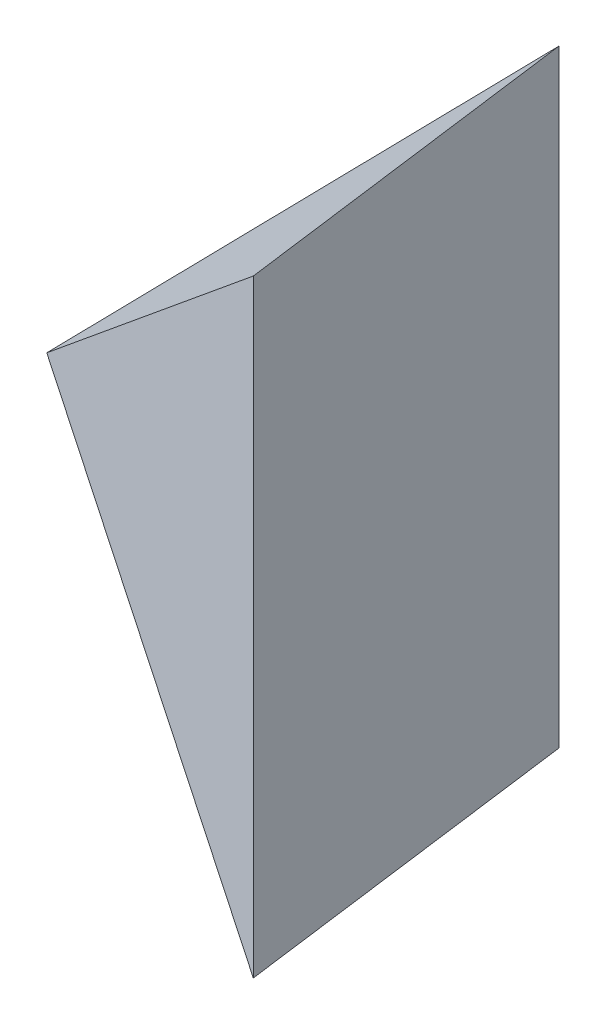
ISO-10303-21;
HEADER;
FILE_DESCRIPTION(('STEP AP214'),'2;1');
FILE_NAME('part.step','',(''),(''),'','','');
FILE_SCHEMA(('AUTOMOTIVE_DESIGN { 1 0 10303 214 1 1 1 1 }'));
ENDSEC;
DATA;
#1=APPLICATION_CONTEXT('core data for automotive mechanical design processes');
#2=APPLICATION_PROTOCOL_DEFINITION('international standard','automotive_design',2000,#1);
#3=PRODUCT_CONTEXT('',#1,'mechanical');
#4=PRODUCT('Part','Part','',(#3));
#5=PRODUCT_RELATED_PRODUCT_CATEGORY('part','',(#4));
#6=PRODUCT_DEFINITION_FORMATION('','',#4);
#7=PRODUCT_DEFINITION_CONTEXT('part definition',#1,'design');
#8=PRODUCT_DEFINITION('design','',#6,#7);
#9=PRODUCT_DEFINITION_SHAPE('','',#8);
#10=(LENGTH_UNIT() NAMED_UNIT(*) SI_UNIT(.MILLI.,.METRE.));
#11=(NAMED_UNIT(*) PLANE_ANGLE_UNIT() SI_UNIT($,.RADIAN.));
#12=(NAMED_UNIT(*) SI_UNIT($,.STERADIAN.) SOLID_ANGLE_UNIT());
#13=UNCERTAINTY_MEASURE_WITH_UNIT(LENGTH_MEASURE(1.E-05),#10,'distance_accuracy_value','');
#14=(GEOMETRIC_REPRESENTATION_CONTEXT(3) GLOBAL_UNCERTAINTY_ASSIGNED_CONTEXT((#13)) GLOBAL_UNIT_ASSIGNED_CONTEXT((#10,
#11,#12)) REPRESENTATION_CONTEXT('',''));
#15=CARTESIAN_POINT('',(0.,0.,0.));
#16=DIRECTION('',(0.,0.,1.));
#17=DIRECTION('',(1.,0.,0.));
#18=AXIS2_PLACEMENT_3D('',#15,#16,#17);
#19=CARTESIAN_POINT('',(730.12734793592,491.98228335744,319.93696683246));
#20=DIRECTION('',(-0.99144486137382,0.,0.130526192219976));
#21=DIRECTION('',(0.,1.,0.));
#22=AXIS2_PLACEMENT_3D('',#19,#20,#21);
#23=PLANE('',#22);
#24=DIRECTION('',(0.,-1.,0.));
#25=VECTOR('',#24,1.);
#26=CARTESIAN_POINT('',(730.12734793592,491.98228335744,319.93696683246));
#27=LINE('',#26,#25);
#28=CARTESIAN_POINT('',(730.12734793592,491.98228335744,319.93696683246));
#29=VERTEX_POINT('',#28);
#30=CARTESIAN_POINT('',(730.12734793592,-456.9822833574,319.93696683246));
#31=VERTEX_POINT('',#30);
#32=EDGE_CURVE('E96',#29,#31,#27,.T.);
#33=ORIENTED_EDGE('',*,*,#32,.T.);
#34=DIRECTION('',(-0.130526192219976,0.,-0.99144486137382));
#35=VECTOR('',#34,1.);
#36=CARTESIAN_POINT('',(730.12734793592,-456.9822833574,319.93696683246));
#37=LINE('',#36,#35);
#38=CARTESIAN_POINT('',(657.77549813668,-456.9822833574,-229.6298938433));
#39=VERTEX_POINT('',#38);
#40=EDGE_CURVE('E92',#31,#39,#37,.T.);
#41=ORIENTED_EDGE('',*,*,#40,.T.);
#42=DIRECTION('',(0.,1.,0.));
#43=VECTOR('',#42,1.);
#44=CARTESIAN_POINT('',(657.77549813668,-456.9822833574,-229.6298938433));
#45=LINE('',#44,#43);
#46=CARTESIAN_POINT('',(657.77549813668,491.98228335744,-229.6298938433));
#47=VERTEX_POINT('',#46);
#48=EDGE_CURVE('E67',#39,#47,#45,.T.);
#49=ORIENTED_EDGE('',*,*,#48,.T.);
#50=DIRECTION('',(0.130526192219976,0.,0.99144486137382));
#51=VECTOR('',#50,1.);
#52=CARTESIAN_POINT('',(657.77549813668,491.98228335744,-229.6298938433));
#53=LINE('',#52,#51);
#54=EDGE_CURVE('E9',#47,#29,#53,.T.);
#55=ORIENTED_EDGE('',*,*,#54,.T.);
#56=EDGE_LOOP('',(#33,#41,#49,#55));
#57=FACE_BOUND('',#56,.T.);
#58=ADVANCED_FACE('F14',(#57),#23,.F.);
#59=CARTESIAN_POINT('',(198.76089070498,17.974482283357,110.6261529388));
#60=DIRECTION('',(-0.99144486137382,0.,0.130526192219976));
#61=DIRECTION('',(0.,1.,0.));
#62=AXIS2_PLACEMENT_3D('',#59,#60,#61);
#63=PLANE('',#62);
#64=DIRECTION('',(0.130526192219976,0.,0.99144486137382));
#65=VECTOR('',#64,1.);
#66=CARTESIAN_POINT('',(198.68853885519,17.974482283357,110.07658607812));
#67=LINE('',#66,#65);
#68=CARTESIAN_POINT('',(198.68853885519,17.974482283357,110.07658607812));
#69=VERTEX_POINT('',#68);
#70=CARTESIAN_POINT('',(198.76089070498,17.974482283357,110.6261529388));
#71=VERTEX_POINT('',#70);
#72=EDGE_CURVE('E20',#69,#71,#67,.T.);
#73=ORIENTED_EDGE('',*,*,#72,.F.);
#74=DIRECTION('',(0.,1.,0.));
#75=VECTOR('',#74,1.);
#76=CARTESIAN_POINT('',(198.68853885519,17.025517716643,110.07658607812));
#77=LINE('',#76,#75);
#78=CARTESIAN_POINT('',(198.68853885519,17.025517716643,110.07658607812));
#79=VERTEX_POINT('',#78);
#80=EDGE_CURVE('E59',#79,#69,#77,.T.);
#81=ORIENTED_EDGE('',*,*,#80,.F.);
#82=DIRECTION('',(-0.130526192219976,0.,-0.99144486137382));
#83=VECTOR('',#82,1.);
#84=CARTESIAN_POINT('',(198.76089070498,17.025517716643,110.6261529388));
#85=LINE('',#84,#83);
#86=CARTESIAN_POINT('',(198.76089070498,17.025517716643,110.6261529388));
#87=VERTEX_POINT('',#86);
#88=EDGE_CURVE('E78',#87,#79,#85,.T.);
#89=ORIENTED_EDGE('',*,*,#88,.F.);
#90=DIRECTION('',(0.,-1.,0.));
#91=VECTOR('',#90,1.);
#92=CARTESIAN_POINT('',(198.76089070498,17.974482283357,110.6261529388));
#93=LINE('',#92,#91);
#94=EDGE_CURVE('E82',#71,#87,#93,.T.);
#95=ORIENTED_EDGE('',*,*,#94,.F.);
#96=EDGE_LOOP('',(#73,#81,#89,#95));
#97=FACE_BOUND('',#96,.T.);
#98=ADVANCED_FACE('F80',(#97),#63,.T.);
#99=CARTESIAN_POINT('',(198.68853885519,17.974482283357,110.07658607812));
#100=CARTESIAN_POINT('',(657.77549813668,491.98228335744,-229.6298938433));
#101=CARTESIAN_POINT('',(198.76089070498,17.974482283357,110.6261529388));
#102=CARTESIAN_POINT('',(730.12734793592,491.98228335744,319.93696683246));
#103=(BOUNDED_SURFACE() B_SPLINE_SURFACE(1,1,((#99,#100),(#101,#102)),.UNSPECIFIED.,.F.,.F.,
.F.) B_SPLINE_SURFACE_WITH_KNOTS((2,2),(2,2),(0.,554.30905145276),(0.,1.),
.UNSPECIFIED.) GEOMETRIC_REPRESENTATION_ITEM() RATIONAL_B_SPLINE_SURFACE(((1.,1.),(1.,1.))) REPRESENTATION_ITEM('') SURFACE());
#104=CARTESIAN_POINT('',(198.76089070498,17.974482283357,110.6261529388));
#105=CARTESIAN_POINT('',(730.12734793592,491.98228335744,319.93696683246));
#106=(BOUNDED_CURVE() B_SPLINE_CURVE(1,(#104,#105),.UNSPECIFIED.,.F.,
.F.) B_SPLINE_CURVE_WITH_KNOTS((2,2),(0.,1.),
.UNSPECIFIED.) CURVE() GEOMETRIC_REPRESENTATION_ITEM() RATIONAL_B_SPLINE_CURVE((1.,1.)) REPRESENTATION_ITEM(''));
#107=EDGE_CURVE('E87',#71,#29,#106,.T.);
#108=CARTESIAN_POINT('',(198.68853885519,17.974482283357,110.07658607812));
#109=CARTESIAN_POINT('',(657.77549813668,491.98228335744,-229.6298938433));
#110=(BOUNDED_CURVE() B_SPLINE_CURVE(1,(#108,#109),.UNSPECIFIED.,.F.,
.F.) B_SPLINE_CURVE_WITH_KNOTS((2,2),(0.,1.),
.UNSPECIFIED.) CURVE() GEOMETRIC_REPRESENTATION_ITEM() RATIONAL_B_SPLINE_CURVE((1.,1.)) REPRESENTATION_ITEM(''));
#111=EDGE_CURVE('E107',#69,#47,#110,.T.);
#112=ORIENTED_EDGE('',*,*,#72,.T.);
#113=ORIENTED_EDGE('',*,*,#107,.T.);
#114=ORIENTED_EDGE('',*,*,#54,.F.);
#115=ORIENTED_EDGE('',*,*,#111,.F.);
#116=EDGE_LOOP('',(#112,#113,#114,#115));
#117=FACE_BOUND('',#116,.T.);
#118=ADVANCED_FACE('F139',(#117),#103,.T.);
#119=CARTESIAN_POINT('',(198.68853885519,17.025517716643,110.07658607812));
#120=CARTESIAN_POINT('',(657.77549813668,-456.9822833574,-229.6298938433));
#121=CARTESIAN_POINT('',(198.68853885519,17.974482283357,110.07658607812));
#122=CARTESIAN_POINT('',(657.77549813668,491.98228335744,-229.6298938433));
#123=(BOUNDED_SURFACE() B_SPLINE_SURFACE(1,1,((#119,#120),(#121,#122)),.UNSPECIFIED.,.F.,.F.,
.F.) B_SPLINE_SURFACE_WITH_KNOTS((2,2),(2,2),(0.,948.96456671488),(0.,1.),
.UNSPECIFIED.) GEOMETRIC_REPRESENTATION_ITEM() RATIONAL_B_SPLINE_SURFACE(((1.,1.),(1.,1.))) REPRESENTATION_ITEM('') SURFACE());
#124=CARTESIAN_POINT('',(198.68853885519,17.025517716643,110.07658607812));
#125=CARTESIAN_POINT('',(657.77549813668,-456.9822833574,-229.6298938433));
#126=(BOUNDED_CURVE() B_SPLINE_CURVE(1,(#124,#125),.UNSPECIFIED.,.F.,
.F.) B_SPLINE_CURVE_WITH_KNOTS((2,2),(0.,1.),
.UNSPECIFIED.) CURVE() GEOMETRIC_REPRESENTATION_ITEM() RATIONAL_B_SPLINE_CURVE((1.,1.)) REPRESENTATION_ITEM(''));
#127=EDGE_CURVE('E86',#79,#39,#126,.T.);
#128=ORIENTED_EDGE('',*,*,#80,.T.);
#129=ORIENTED_EDGE('',*,*,#111,.T.);
#130=ORIENTED_EDGE('',*,*,#48,.F.);
#131=ORIENTED_EDGE('',*,*,#127,.F.);
#132=EDGE_LOOP('',(#128,#129,#130,#131));
#133=FACE_BOUND('',#132,.T.);
#134=ADVANCED_FACE('F138',(#133),#123,.T.);
#135=CARTESIAN_POINT('',(198.76089070498,17.025517716643,110.6261529388));
#136=CARTESIAN_POINT('',(730.12734793592,-456.9822833574,319.93696683246));
#137=CARTESIAN_POINT('',(198.68853885519,17.025517716643,110.07658607812));
#138=CARTESIAN_POINT('',(657.77549813668,-456.9822833574,-229.6298938433));
#139=(BOUNDED_SURFACE() B_SPLINE_SURFACE(1,1,((#135,#136),(#137,#138)),.UNSPECIFIED.,.F.,.F.,
.F.) B_SPLINE_SURFACE_WITH_KNOTS((2,2),(2,2),(0.,554.30905145276),(0.,1.),
.UNSPECIFIED.) GEOMETRIC_REPRESENTATION_ITEM() RATIONAL_B_SPLINE_SURFACE(((1.,1.),(1.,1.))) REPRESENTATION_ITEM('') SURFACE());
#140=CARTESIAN_POINT('',(198.76089070498,17.025517716643,110.6261529388));
#141=CARTESIAN_POINT('',(730.12734793592,-456.9822833574,319.93696683246));
#142=(BOUNDED_CURVE() B_SPLINE_CURVE(1,(#140,#141),.UNSPECIFIED.,.F.,
.F.) B_SPLINE_CURVE_WITH_KNOTS((2,2),(0.,1.),
.UNSPECIFIED.) CURVE() GEOMETRIC_REPRESENTATION_ITEM() RATIONAL_B_SPLINE_CURVE((1.,1.)) REPRESENTATION_ITEM(''));
#143=EDGE_CURVE('E90',#87,#31,#142,.T.);
#144=ORIENTED_EDGE('',*,*,#88,.T.);
#145=ORIENTED_EDGE('',*,*,#127,.T.);
#146=ORIENTED_EDGE('',*,*,#40,.F.);
#147=ORIENTED_EDGE('',*,*,#143,.F.);
#148=EDGE_LOOP('',(#144,#145,#146,#147));
#149=FACE_BOUND('',#148,.T.);
#150=ADVANCED_FACE('F91',(#149),#139,.T.);
#151=CARTESIAN_POINT('',(198.76089070498,17.974482283357,110.6261529388));
#152=CARTESIAN_POINT('',(730.12734793592,491.98228335744,319.93696683246));
#153=CARTESIAN_POINT('',(198.76089070498,17.025517716643,110.6261529388));
#154=CARTESIAN_POINT('',(730.12734793592,-456.9822833574,319.93696683246));
#155=(BOUNDED_SURFACE() B_SPLINE_SURFACE(1,1,((#151,#152),(#153,#154)),.UNSPECIFIED.,.F.,.F.,
.F.) B_SPLINE_SURFACE_WITH_KNOTS((2,2),(2,2),(0.,948.96456671488),(0.,1.),
.UNSPECIFIED.) GEOMETRIC_REPRESENTATION_ITEM() RATIONAL_B_SPLINE_SURFACE(((1.,1.),(1.,1.))) REPRESENTATION_ITEM('') SURFACE());
#156=ORIENTED_EDGE('',*,*,#94,.T.);
#157=ORIENTED_EDGE('',*,*,#143,.T.);
#158=ORIENTED_EDGE('',*,*,#32,.F.);
#159=ORIENTED_EDGE('',*,*,#107,.F.);
#160=EDGE_LOOP('',(#156,#157,#158,#159));
#161=FACE_BOUND('',#160,.T.);
#162=ADVANCED_FACE('F16',(#161),#155,.T.);
#163=CLOSED_SHELL('',(#58,#98,#118,#134,#150,#162));
#164=MANIFOLD_SOLID_BREP('B1',#163);
#165=ADVANCED_BREP_SHAPE_REPRESENTATION('',(#18,#164),#14);
#166=SHAPE_DEFINITION_REPRESENTATION(#9,#165);
ENDSEC;
END-ISO-10303-21;
